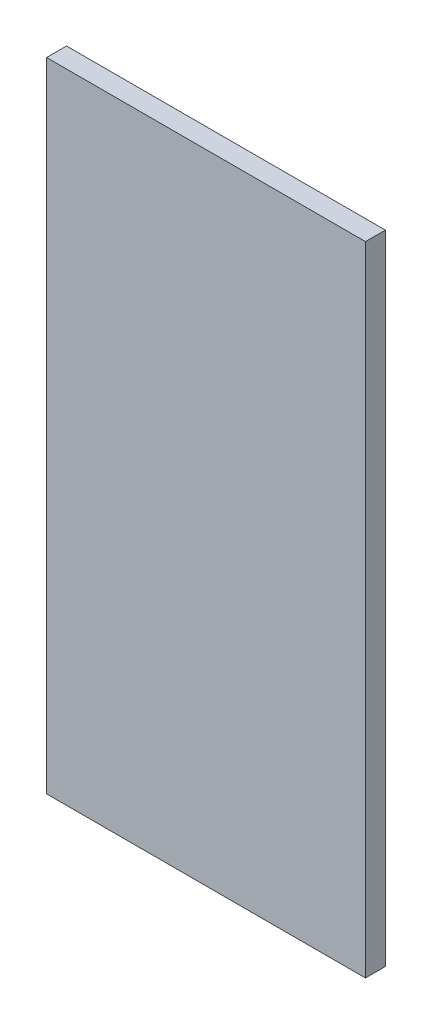
ISO-10303-21;
HEADER;
FILE_DESCRIPTION(('STEP AP214'),'2;1');
FILE_NAME('part.step','',(''),(''),'','','');
FILE_SCHEMA(('AUTOMOTIVE_DESIGN { 1 0 10303 214 1 1 1 1 }'));
ENDSEC;
DATA;
#1=APPLICATION_CONTEXT('core data for automotive mechanical design processes');
#2=APPLICATION_PROTOCOL_DEFINITION('international standard','automotive_design',2000,#1);
#3=PRODUCT_CONTEXT('',#1,'mechanical');
#4=PRODUCT('Part','Part','',(#3));
#5=PRODUCT_RELATED_PRODUCT_CATEGORY('part','',(#4));
#6=PRODUCT_DEFINITION_FORMATION('','',#4);
#7=PRODUCT_DEFINITION_CONTEXT('part definition',#1,'design');
#8=PRODUCT_DEFINITION('design','',#6,#7);
#9=PRODUCT_DEFINITION_SHAPE('','',#8);
#10=(LENGTH_UNIT() NAMED_UNIT(*) SI_UNIT(.MILLI.,.METRE.));
#11=(NAMED_UNIT(*) PLANE_ANGLE_UNIT() SI_UNIT($,.RADIAN.));
#12=(NAMED_UNIT(*) SI_UNIT($,.STERADIAN.) SOLID_ANGLE_UNIT());
#13=UNCERTAINTY_MEASURE_WITH_UNIT(LENGTH_MEASURE(1.E-05),#10,'distance_accuracy_value','');
#14=(GEOMETRIC_REPRESENTATION_CONTEXT(3) GLOBAL_UNCERTAINTY_ASSIGNED_CONTEXT((#13)) GLOBAL_UNIT_ASSIGNED_CONTEXT((#10,
#11,#12)) REPRESENTATION_CONTEXT('',''));
#15=CARTESIAN_POINT('',(0.,0.,0.));
#16=DIRECTION('',(0.,0.,1.));
#17=DIRECTION('',(1.,0.,0.));
#18=AXIS2_PLACEMENT_3D('',#15,#16,#17);
#19=CARTESIAN_POINT('',(12.7,25.4,1.5875));
#20=DIRECTION('',(-1.,0.,0.));
#21=DIRECTION('',(0.,-1.,0.));
#22=AXIS2_PLACEMENT_3D('',#19,#20,#21);
#23=PLANE('',#22);
#24=DIRECTION('',(0.,1.,0.));
#25=VECTOR('',#24,1.);
#26=CARTESIAN_POINT('',(12.7,25.4,0.));
#27=LINE('',#26,#25);
#28=CARTESIAN_POINT('',(12.7,-25.4,0.));
#29=VERTEX_POINT('',#28);
#30=CARTESIAN_POINT('',(12.7,25.4,0.));
#31=VERTEX_POINT('',#30);
#32=EDGE_CURVE('E102',#29,#31,#27,.T.);
#33=ORIENTED_EDGE('',*,*,#32,.T.);
#34=DIRECTION('',(0.,0.,-1.));
#35=VECTOR('',#34,1.);
#36=CARTESIAN_POINT('',(12.7,25.4,1.5875));
#37=LINE('',#36,#35);
#38=CARTESIAN_POINT('',(12.7,25.4,1.5875));
#39=VERTEX_POINT('',#38);
#40=EDGE_CURVE('E11',#39,#31,#37,.T.);
#41=ORIENTED_EDGE('',*,*,#40,.F.);
#42=DIRECTION('',(0.,1.,0.));
#43=VECTOR('',#42,1.);
#44=CARTESIAN_POINT('',(12.7,25.4,1.5875));
#45=LINE('',#44,#43);
#46=CARTESIAN_POINT('',(12.7,-25.4,1.5875));
#47=VERTEX_POINT('',#46);
#48=EDGE_CURVE('E90',#47,#39,#45,.T.);
#49=ORIENTED_EDGE('',*,*,#48,.F.);
#50=DIRECTION('',(0.,0.,-1.));
#51=VECTOR('',#50,1.);
#52=CARTESIAN_POINT('',(12.7,-25.4,1.5875));
#53=LINE('',#52,#51);
#54=EDGE_CURVE('E98',#47,#29,#53,.T.);
#55=ORIENTED_EDGE('',*,*,#54,.T.);
#56=EDGE_LOOP('',(#33,#41,#49,#55));
#57=FACE_BOUND('',#56,.T.);
#58=ADVANCED_FACE('F39',(#57),#23,.F.);
#59=CARTESIAN_POINT('',(-12.7,25.4,1.5875));
#60=DIRECTION('',(0.,-1.,0.));
#61=DIRECTION('',(0.,0.,-1.));
#62=AXIS2_PLACEMENT_3D('',#59,#60,#61);
#63=PLANE('',#62);
#64=DIRECTION('',(-1.,0.,0.));
#65=VECTOR('',#64,1.);
#66=CARTESIAN_POINT('',(-12.7,25.4,0.));
#67=LINE('',#66,#65);
#68=CARTESIAN_POINT('',(-12.7,25.4,0.));
#69=VERTEX_POINT('',#68);
#70=EDGE_CURVE('E94',#31,#69,#67,.T.);
#71=ORIENTED_EDGE('',*,*,#70,.T.);
#72=DIRECTION('',(0.,0.,-1.));
#73=VECTOR('',#72,1.);
#74=CARTESIAN_POINT('',(-12.7,25.4,1.5875));
#75=LINE('',#74,#73);
#76=CARTESIAN_POINT('',(-12.7,25.4,1.5875));
#77=VERTEX_POINT('',#76);
#78=EDGE_CURVE('E47',#77,#69,#75,.T.);
#79=ORIENTED_EDGE('',*,*,#78,.F.);
#80=DIRECTION('',(-1.,0.,0.));
#81=VECTOR('',#80,1.);
#82=CARTESIAN_POINT('',(-12.7,25.4,1.5875));
#83=LINE('',#82,#81);
#84=EDGE_CURVE('E85',#39,#77,#83,.T.);
#85=ORIENTED_EDGE('',*,*,#84,.F.);
#86=ORIENTED_EDGE('',*,*,#40,.T.);
#87=EDGE_LOOP('',(#71,#79,#85,#86));
#88=FACE_BOUND('',#87,.T.);
#89=ADVANCED_FACE('F93',(#88),#63,.F.);
#90=CARTESIAN_POINT('',(-12.7,25.4,1.5875));
#91=DIRECTION('',(1.,0.,0.));
#92=DIRECTION('',(0.,1.,0.));
#93=AXIS2_PLACEMENT_3D('',#90,#91,#92);
#94=PLANE('',#93);
#95=DIRECTION('',(0.,-1.,0.));
#96=VECTOR('',#95,1.);
#97=CARTESIAN_POINT('',(-12.7,25.4,0.));
#98=LINE('',#97,#96);
#99=CARTESIAN_POINT('',(-12.7,-25.4,0.));
#100=VERTEX_POINT('',#99);
#101=EDGE_CURVE('E72',#69,#100,#98,.T.);
#102=ORIENTED_EDGE('',*,*,#101,.T.);
#103=DIRECTION('',(0.,0.,-1.));
#104=VECTOR('',#103,1.);
#105=CARTESIAN_POINT('',(-12.7,-25.4,1.5875));
#106=LINE('',#105,#104);
#107=CARTESIAN_POINT('',(-12.7,-25.4,1.5875));
#108=VERTEX_POINT('',#107);
#109=EDGE_CURVE('E95',#108,#100,#106,.T.);
#110=ORIENTED_EDGE('',*,*,#109,.F.);
#111=DIRECTION('',(0.,-1.,0.));
#112=VECTOR('',#111,1.);
#113=CARTESIAN_POINT('',(-12.7,25.4,1.5875));
#114=LINE('',#113,#112);
#115=EDGE_CURVE('E88',#77,#108,#114,.T.);
#116=ORIENTED_EDGE('',*,*,#115,.F.);
#117=ORIENTED_EDGE('',*,*,#78,.T.);
#118=EDGE_LOOP('',(#102,#110,#116,#117));
#119=FACE_BOUND('',#118,.T.);
#120=ADVANCED_FACE('F96',(#119),#94,.F.);
#121=CARTESIAN_POINT('',(-12.7,-25.4,1.5875));
#122=DIRECTION('',(0.,1.,0.));
#123=DIRECTION('',(0.,0.,1.));
#124=AXIS2_PLACEMENT_3D('',#121,#122,#123);
#125=PLANE('',#124);
#126=DIRECTION('',(1.,0.,0.));
#127=VECTOR('',#126,1.);
#128=CARTESIAN_POINT('',(-12.7,-25.4,0.));
#129=LINE('',#128,#127);
#130=EDGE_CURVE('E78',#100,#29,#129,.T.);
#131=ORIENTED_EDGE('',*,*,#130,.T.);
#132=ORIENTED_EDGE('',*,*,#54,.F.);
#133=DIRECTION('',(1.,0.,0.));
#134=VECTOR('',#133,1.);
#135=CARTESIAN_POINT('',(-12.7,-25.4,1.5875));
#136=LINE('',#135,#134);
#137=EDGE_CURVE('E55',#108,#47,#136,.T.);
#138=ORIENTED_EDGE('',*,*,#137,.F.);
#139=ORIENTED_EDGE('',*,*,#109,.T.);
#140=EDGE_LOOP('',(#131,#132,#138,#139));
#141=FACE_BOUND('',#140,.T.);
#142=ADVANCED_FACE('F109',(#141),#125,.F.);
#143=CARTESIAN_POINT('',(0.,0.,1.5875));
#144=DIRECTION('',(0.,0.,1.));
#145=DIRECTION('',(1.,0.,0.));
#146=AXIS2_PLACEMENT_3D('',#143,#144,#145);
#147=PLANE('',#146);
#148=ORIENTED_EDGE('',*,*,#48,.T.);
#149=ORIENTED_EDGE('',*,*,#84,.T.);
#150=ORIENTED_EDGE('',*,*,#115,.T.);
#151=ORIENTED_EDGE('',*,*,#137,.T.);
#152=EDGE_LOOP('',(#148,#149,#150,#151));
#153=FACE_BOUND('',#152,.T.);
#154=ADVANCED_FACE('F86',(#153),#147,.T.);
#155=CARTESIAN_POINT('',(0.,0.,0.));
#156=DIRECTION('',(0.,0.,1.));
#157=DIRECTION('',(1.,0.,0.));
#158=AXIS2_PLACEMENT_3D('',#155,#156,#157);
#159=PLANE('',#158);
#160=ORIENTED_EDGE('',*,*,#32,.F.);
#161=ORIENTED_EDGE('',*,*,#130,.F.);
#162=ORIENTED_EDGE('',*,*,#101,.F.);
#163=ORIENTED_EDGE('',*,*,#70,.F.);
#164=EDGE_LOOP('',(#160,#161,#162,#163));
#165=FACE_BOUND('',#164,.T.);
#166=ADVANCED_FACE('F112',(#165),#159,.F.);
#167=CLOSED_SHELL('',(#58,#89,#120,#142,#154,#166));
#168=MANIFOLD_SOLID_BREP('B2',#167);
#169=ADVANCED_BREP_SHAPE_REPRESENTATION('',(#18,#168),#14);
#170=SHAPE_DEFINITION_REPRESENTATION(#9,#169);
ENDSEC;
END-ISO-10303-21;
